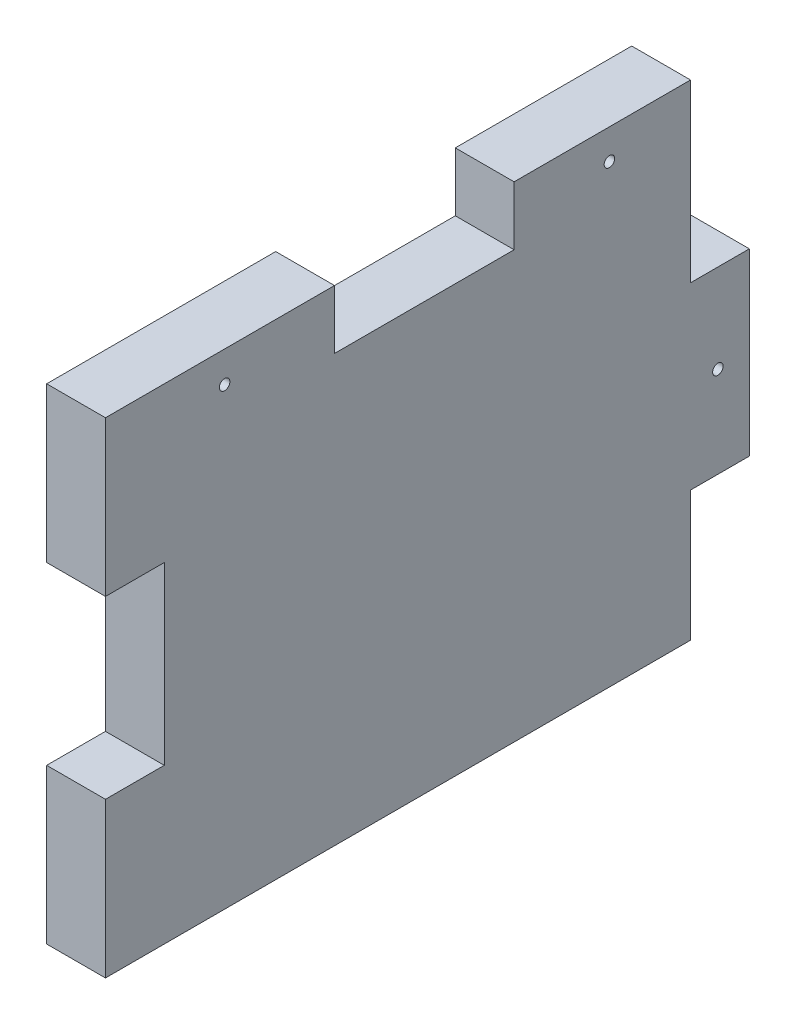
ISO-10303-21;
HEADER;
FILE_DESCRIPTION(('STEP AP214'),'2;1');
FILE_NAME('part.step','',(''),(''),'','','');
FILE_SCHEMA(('AUTOMOTIVE_DESIGN { 1 0 10303 214 1 1 1 1 }'));
ENDSEC;
DATA;
#1=APPLICATION_CONTEXT('core data for automotive mechanical design processes');
#2=APPLICATION_PROTOCOL_DEFINITION('international standard','automotive_design',2000,#1);
#3=PRODUCT_CONTEXT('',#1,'mechanical');
#4=PRODUCT('Part','Part','',(#3));
#5=PRODUCT_RELATED_PRODUCT_CATEGORY('part','',(#4));
#6=PRODUCT_DEFINITION_FORMATION('','',#4);
#7=PRODUCT_DEFINITION_CONTEXT('part definition',#1,'design');
#8=PRODUCT_DEFINITION('design','',#6,#7);
#9=PRODUCT_DEFINITION_SHAPE('','',#8);
#10=(LENGTH_UNIT() NAMED_UNIT(*) SI_UNIT(.MILLI.,.METRE.));
#11=(NAMED_UNIT(*) PLANE_ANGLE_UNIT() SI_UNIT($,.RADIAN.));
#12=(NAMED_UNIT(*) SI_UNIT($,.STERADIAN.) SOLID_ANGLE_UNIT());
#13=UNCERTAINTY_MEASURE_WITH_UNIT(LENGTH_MEASURE(1.E-05),#10,'distance_accuracy_value','');
#14=(GEOMETRIC_REPRESENTATION_CONTEXT(3) GLOBAL_UNCERTAINTY_ASSIGNED_CONTEXT((#13)) GLOBAL_UNIT_ASSIGNED_CONTEXT((#10,
#11,#12)) REPRESENTATION_CONTEXT('',''));
#15=CARTESIAN_POINT('',(0.,0.,0.));
#16=DIRECTION('',(0.,0.,1.));
#17=DIRECTION('',(1.,0.,0.));
#18=AXIS2_PLACEMENT_3D('',#15,#16,#17);
#19=CARTESIAN_POINT('',(0.,0.,189.));
#20=DIRECTION('',(0.,0.,1.));
#21=DIRECTION('',(1.,0.,0.));
#22=AXIS2_PLACEMENT_3D('',#19,#20,#21);
#23=PLANE('',#22);
#24=DIRECTION('',(0.,1.,0.));
#25=VECTOR('',#24,1.);
#26=CARTESIAN_POINT('',(-1878.01840884108,3374.03154429096,189.));
#27=LINE('',#26,#25);
#28=CARTESIAN_POINT('',(-1878.01840884108,3267.29154429096,189.));
#29=VERTEX_POINT('',#28);
#30=CARTESIAN_POINT('',(-1878.01840884108,3324.03154429097,189.));
#31=VERTEX_POINT('',#30);
#32=EDGE_CURVE('E155',#29,#31,#27,.T.);
#33=ORIENTED_EDGE('',*,*,#32,.T.);
#34=CARTESIAN_POINT('',(-1878.01840884108,3324.03154429097,189.));
#35=CARTESIAN_POINT('',(-1897.01840884108,3324.03154429097,189.));
#36=B_SPLINE_CURVE_WITH_KNOTS('',1,(#34,#35),.UNSPECIFIED.,.F.,.F.,(2,2),(0.,0.13768115942029),.UNSPECIFIED.);
#37=CARTESIAN_POINT('',(-1897.01840884108,3324.03154429097,189.));
#38=VERTEX_POINT('',#37);
#39=EDGE_CURVE('E160',#31,#38,#36,.T.);
#40=ORIENTED_EDGE('',*,*,#39,.T.);
#41=DIRECTION('',(0.,-1.,0.));
#42=VECTOR('',#41,1.);
#43=CARTESIAN_POINT('',(-1897.01840884108,3374.03154429096,189.));
#44=LINE('',#43,#42);
#45=CARTESIAN_POINT('',(-1897.01840884108,3267.29154429096,189.));
#46=VERTEX_POINT('',#45);
#47=EDGE_CURVE('E168',#38,#46,#44,.T.);
#48=ORIENTED_EDGE('',*,*,#47,.T.);
#49=CARTESIAN_POINT('',(-1897.01840884108,3267.29154429096,189.));
#50=CARTESIAN_POINT('',(-1878.01840884108,3267.29154429096,189.));
#51=B_SPLINE_CURVE_WITH_KNOTS('',1,(#49,#50),.UNSPECIFIED.,.F.,.F.,(2,2),(0.5,0.63768115942029),.UNSPECIFIED.);
#52=EDGE_CURVE('E166',#46,#29,#51,.T.);
#53=ORIENTED_EDGE('',*,*,#52,.T.);
#54=EDGE_LOOP('',(#33,#40,#48,#53));
#55=FACE_BOUND('',#54,.T.);
#56=ADVANCED_FACE('F33',(#55),#23,.T.);
#57=CARTESIAN_POINT('',(-1897.01840884108,3374.03154429096,189.));
#58=DIRECTION('',(0.,-1.,0.));
#59=DIRECTION('',(0.,0.,-1.));
#60=AXIS2_PLACEMENT_3D('',#57,#58,#59);
#61=PLANE('',#60);
#62=DIRECTION('',(0.,0.,-1.));
#63=VECTOR('',#62,1.);
#64=CARTESIAN_POINT('',(-1897.01840884108,3374.03154429096,189.));
#65=LINE('',#64,#63);
#66=CARTESIAN_POINT('',(-1897.01840884108,3374.03154429096,75.99));
#67=VERTEX_POINT('',#66);
#68=CARTESIAN_POINT('',(-1897.01840884108,3374.03154429096,19.));
#69=VERTEX_POINT('',#68);
#70=EDGE_CURVE('E167',#67,#69,#65,.T.);
#71=ORIENTED_EDGE('',*,*,#70,.F.);
#72=DIRECTION('',(1.,0.,0.));
#73=VECTOR('',#72,1.);
#74=CARTESIAN_POINT('',(-1897.01840884108,3374.03154429096,75.99));
#75=LINE('',#74,#73);
#76=CARTESIAN_POINT('',(-1878.01840884108,3374.03154429096,75.99));
#77=VERTEX_POINT('',#76);
#78=EDGE_CURVE('E11',#67,#77,#75,.T.);
#79=ORIENTED_EDGE('',*,*,#78,.T.);
#80=DIRECTION('',(0.,0.,-1.));
#81=VECTOR('',#80,1.);
#82=CARTESIAN_POINT('',(-1878.01840884108,3374.03154429096,189.));
#83=LINE('',#82,#81);
#84=CARTESIAN_POINT('',(-1878.01840884108,3374.03154429096,19.));
#85=VERTEX_POINT('',#84);
#86=EDGE_CURVE('E189',#77,#85,#83,.T.);
#87=ORIENTED_EDGE('',*,*,#86,.T.);
#88=DIRECTION('',(-1.,0.,0.));
#89=VECTOR('',#88,1.);
#90=CARTESIAN_POINT('',(-1897.01840884108,3374.03154429096,19.));
#91=LINE('',#90,#89);
#92=EDGE_CURVE('E172',#85,#69,#91,.T.);
#93=ORIENTED_EDGE('',*,*,#92,.T.);
#94=EDGE_LOOP('',(#71,#79,#87,#93));
#95=FACE_BOUND('',#94,.T.);
#96=ADVANCED_FACE('F332',(#95),#61,.F.);
#97=CARTESIAN_POINT('',(0.,0.,19.));
#98=DIRECTION('',(0.,0.,1.));
#99=DIRECTION('',(1.,0.,0.));
#100=AXIS2_PLACEMENT_3D('',#97,#98,#99);
#101=PLANE('',#100);
#102=CARTESIAN_POINT('',(-1878.01840884108,3259.29154429096,19.));
#103=CARTESIAN_POINT('',(-1897.01840884108,3259.29154429096,19.));
#104=B_SPLINE_CURVE_WITH_KNOTS('',1,(#102,#103),.UNSPECIFIED.,.F.,.F.,(2,2),(0.,
0.123376623376623),.UNSPECIFIED.);
#105=CARTESIAN_POINT('',(-1878.01840884108,3259.29154429096,19.));
#106=VERTEX_POINT('',#105);
#107=CARTESIAN_POINT('',(-1897.01840884108,3259.29154429096,19.));
#108=VERTEX_POINT('',#107);
#109=EDGE_CURVE('E277',#106,#108,#104,.T.);
#110=ORIENTED_EDGE('',*,*,#109,.F.);
#111=DIRECTION('',(0.,1.,0.));
#112=VECTOR('',#111,1.);
#113=CARTESIAN_POINT('',(-1878.01840884108,3374.03154429096,19.));
#114=LINE('',#113,#112);
#115=CARTESIAN_POINT('',(-1878.01840884108,3217.29154429096,19.));
#116=VERTEX_POINT('',#115);
#117=EDGE_CURVE('E183',#116,#106,#114,.T.);
#118=ORIENTED_EDGE('',*,*,#117,.F.);
#119=DIRECTION('',(1.,0.,0.));
#120=VECTOR('',#119,1.);
#121=CARTESIAN_POINT('',(-1897.01840884108,3217.29154429096,19.));
#122=LINE('',#121,#120);
#123=CARTESIAN_POINT('',(-1897.01840884108,3217.29154429096,19.));
#124=VERTEX_POINT('',#123);
#125=EDGE_CURVE('E179',#124,#116,#122,.T.);
#126=ORIENTED_EDGE('',*,*,#125,.F.);
#127=DIRECTION('',(0.,-1.,0.));
#128=VECTOR('',#127,1.);
#129=CARTESIAN_POINT('',(-1897.01840884108,3374.03154429096,19.));
#130=LINE('',#129,#128);
#131=EDGE_CURVE('E180',#108,#124,#130,.T.);
#132=ORIENTED_EDGE('',*,*,#131,.F.);
#133=EDGE_LOOP('',(#110,#118,#126,#132));
#134=FACE_BOUND('',#133,.T.);
#135=ADVANCED_FACE('F316',(#134),#101,.F.);
#136=CARTESIAN_POINT('',(-1897.01840884108,3317.29154429096,19.));
#137=CARTESIAN_POINT('',(-1878.01840884108,3317.29154429096,19.));
#138=B_SPLINE_CURVE_WITH_KNOTS('',1,(#136,#137),.UNSPECIFIED.,.F.,.F.,(2,2),(0.5,
0.623376623376623),.UNSPECIFIED.);
#139=CARTESIAN_POINT('',(-1897.01840884108,3317.29154429096,19.));
#140=VERTEX_POINT('',#139);
#141=CARTESIAN_POINT('',(-1878.01840884108,3317.29154429096,19.));
#142=VERTEX_POINT('',#141);
#143=EDGE_CURVE('E270',#140,#142,#138,.T.);
#144=ORIENTED_EDGE('',*,*,#143,.F.);
#145=EDGE_CURVE('E176',#69,#140,#130,.T.);
#146=ORIENTED_EDGE('',*,*,#145,.F.);
#147=ORIENTED_EDGE('',*,*,#92,.F.);
#148=EDGE_CURVE('E182',#142,#85,#114,.T.);
#149=ORIENTED_EDGE('',*,*,#148,.F.);
#150=EDGE_LOOP('',(#144,#146,#147,#149));
#151=FACE_BOUND('',#150,.T.);
#152=ADVANCED_FACE('F327',(#151),#101,.F.);
#153=CARTESIAN_POINT('',(-1897.01840884108,3374.03154429096,189.));
#154=DIRECTION('',(1.,0.,0.));
#155=DIRECTION('',(0.,0.,-1.));
#156=AXIS2_PLACEMENT_3D('',#153,#154,#155);
#157=PLANE('',#156);
#158=CARTESIAN_POINT('',(-1897.01840884108,3288.70209537855,10.167430180868));
#159=DIRECTION('',(-1.,0.,0.));
#160=DIRECTION('',(0.,0.,1.));
#161=AXIS2_PLACEMENT_3D('',#158,#159,#160);
#162=CIRCLE('',#161,1.70000000000003);
#163=CARTESIAN_POINT('',(-1897.01840884108,3288.70209537855,11.867430180868));
#164=VERTEX_POINT('',#163);
#165=EDGE_CURVE('E363',#164,#164,#162,.T.);
#166=ORIENTED_EDGE('',*,*,#165,.F.);
#167=EDGE_LOOP('',(#166));
#168=FACE_BOUND('',#167,.T.);
#169=CARTESIAN_POINT('',(-1897.01840884108,3364.29610942721,45.2046557399301));
#170=DIRECTION('',(-1.,0.,0.));
#171=DIRECTION('',(0.,0.,1.));
#172=AXIS2_PLACEMENT_3D('',#169,#170,#171);
#173=CIRCLE('',#172,1.70000000000003);
#174=CARTESIAN_POINT('',(-1897.01840884108,3364.29610942721,46.9046557399301));
#175=VERTEX_POINT('',#174);
#176=EDGE_CURVE('E357',#175,#175,#173,.T.);
#177=ORIENTED_EDGE('',*,*,#176,.F.);
#178=EDGE_LOOP('',(#177));
#179=FACE_BOUND('',#178,.T.);
#180=CARTESIAN_POINT('',(-1897.01840884108,3364.05612843023,169.514812175507));
#181=DIRECTION('',(-1.,0.,0.));
#182=DIRECTION('',(0.,0.,1.));
#183=AXIS2_PLACEMENT_3D('',#180,#181,#182);
#184=CIRCLE('',#183,1.70000000000003);
#185=CARTESIAN_POINT('',(-1897.01840884108,3364.05612843023,171.214812175507));
#186=VERTEX_POINT('',#185);
#187=EDGE_CURVE('E351',#186,#186,#184,.T.);
#188=ORIENTED_EDGE('',*,*,#187,.F.);
#189=EDGE_LOOP('',(#188));
#190=FACE_BOUND('',#189,.T.);
#191=DIRECTION('',(0.,0.,1.));
#192=VECTOR('',#191,1.);
#193=CARTESIAN_POINT('',(-1897.01840884108,3355.02154429096,134.01));
#194=LINE('',#193,#192);
#195=CARTESIAN_POINT('',(-1897.01840884108,3355.02154429096,75.99));
#196=VERTEX_POINT('',#195);
#197=CARTESIAN_POINT('',(-1897.01840884108,3355.02154429096,134.01));
#198=VERTEX_POINT('',#197);
#199=EDGE_CURVE('E239',#196,#198,#194,.T.);
#200=ORIENTED_EDGE('',*,*,#199,.F.);
#201=DIRECTION('',(0.,-1.,0.));
#202=VECTOR('',#201,1.);
#203=CARTESIAN_POINT('',(-1897.01840884108,3355.02154429096,75.99));
#204=LINE('',#203,#202);
#205=EDGE_CURVE('E242',#67,#196,#204,.T.);
#206=ORIENTED_EDGE('',*,*,#205,.F.);
#207=ORIENTED_EDGE('',*,*,#70,.T.);
#208=ORIENTED_EDGE('',*,*,#145,.T.);
#209=DIRECTION('',(0.,0.,1.));
#210=VECTOR('',#209,1.);
#211=CARTESIAN_POINT('',(-1897.01840884108,3317.29154429096,-19.));
#212=LINE('',#211,#210);
#213=CARTESIAN_POINT('',(-1897.01840884108,3317.29154429096,0.));
#214=VERTEX_POINT('',#213);
#215=EDGE_CURVE('E276',#214,#140,#212,.T.);
#216=ORIENTED_EDGE('',*,*,#215,.F.);
#217=DIRECTION('',(0.,1.,0.));
#218=VECTOR('',#217,1.);
#219=CARTESIAN_POINT('',(-1897.01840884108,3259.29154429096,0.));
#220=LINE('',#219,#218);
#221=CARTESIAN_POINT('',(-1897.01840884108,3259.29154429096,0.));
#222=VERTEX_POINT('',#221);
#223=EDGE_CURVE('E292',#222,#214,#220,.T.);
#224=ORIENTED_EDGE('',*,*,#223,.F.);
#225=DIRECTION('',(0.,0.,1.));
#226=VECTOR('',#225,1.);
#227=CARTESIAN_POINT('',(-1897.01840884108,3259.29154429096,-19.));
#228=LINE('',#227,#226);
#229=EDGE_CURVE('E285',#222,#108,#228,.T.);
#230=ORIENTED_EDGE('',*,*,#229,.T.);
#231=ORIENTED_EDGE('',*,*,#131,.T.);
#232=DIRECTION('',(0.,0.,-1.));
#233=VECTOR('',#232,1.);
#234=CARTESIAN_POINT('',(-1897.01840884108,3217.29154429096,189.));
#235=LINE('',#234,#233);
#236=CARTESIAN_POINT('',(-1897.01840884108,3217.29154429096,208.));
#237=VERTEX_POINT('',#236);
#238=EDGE_CURVE('E196',#237,#124,#235,.T.);
#239=ORIENTED_EDGE('',*,*,#238,.F.);
#240=DIRECTION('',(0.,-1.,0.));
#241=VECTOR('',#240,1.);
#242=CARTESIAN_POINT('',(-1897.01840884108,3217.29154429096,208.));
#243=LINE('',#242,#241);
#244=CARTESIAN_POINT('',(-1897.01840884108,3267.29154429096,208.));
#245=VERTEX_POINT('',#244);
#246=EDGE_CURVE('E225',#245,#237,#243,.T.);
#247=ORIENTED_EDGE('',*,*,#246,.F.);
#248=DIRECTION('',(0.,0.,-1.));
#249=VECTOR('',#248,1.);
#250=CARTESIAN_POINT('',(-1897.01840884108,3267.29154429096,227.));
#251=LINE('',#250,#249);
#252=EDGE_CURVE('E214',#245,#46,#251,.T.);
#253=ORIENTED_EDGE('',*,*,#252,.T.);
#254=ORIENTED_EDGE('',*,*,#47,.F.);
#255=DIRECTION('',(0.,0.,-1.));
#256=VECTOR('',#255,1.);
#257=CARTESIAN_POINT('',(-1897.01840884108,3324.03154429097,227.));
#258=LINE('',#257,#256);
#259=CARTESIAN_POINT('',(-1897.01840884108,3324.03154429097,208.));
#260=VERTEX_POINT('',#259);
#261=EDGE_CURVE('E48',#260,#38,#258,.T.);
#262=ORIENTED_EDGE('',*,*,#261,.F.);
#263=DIRECTION('',(0.,-1.,0.));
#264=VECTOR('',#263,1.);
#265=CARTESIAN_POINT('',(-1897.01840884108,3324.03154429097,208.));
#266=LINE('',#265,#264);
#267=CARTESIAN_POINT('',(-1897.01840884108,3374.03154429096,208.));
#268=VERTEX_POINT('',#267);
#269=EDGE_CURVE('E210',#268,#260,#266,.T.);
#270=ORIENTED_EDGE('',*,*,#269,.F.);
#271=CARTESIAN_POINT('',(-1897.01840884108,3374.03154429096,134.01));
#272=VERTEX_POINT('',#271);
#273=EDGE_CURVE('E170',#268,#272,#65,.T.);
#274=ORIENTED_EDGE('',*,*,#273,.T.);
#275=DIRECTION('',(0.,1.,0.));
#276=VECTOR('',#275,1.);
#277=CARTESIAN_POINT('',(-1897.01840884108,3374.04154429096,134.01));
#278=LINE('',#277,#276);
#279=EDGE_CURVE('E209',#198,#272,#278,.T.);
#280=ORIENTED_EDGE('',*,*,#279,.F.);
#281=EDGE_LOOP('',(#200,#206,#207,#208,#216,#224,#230,#231,#239,#247,#253,#254,#262,#270,#274,#280));
#282=FACE_BOUND('',#281,.T.);
#283=ADVANCED_FACE('F35',(#168,#179,#190,#282),#157,.F.);
#284=CARTESIAN_POINT('',(-1897.01840884108,3217.29154429096,189.));
#285=DIRECTION('',(0.,1.,0.));
#286=DIRECTION('',(0.,0.,1.));
#287=AXIS2_PLACEMENT_3D('',#284,#285,#286);
#288=PLANE('',#287);
#289=ORIENTED_EDGE('',*,*,#125,.T.);
#290=DIRECTION('',(0.,0.,-1.));
#291=VECTOR('',#290,1.);
#292=CARTESIAN_POINT('',(-1878.01840884108,3217.29154429096,189.));
#293=LINE('',#292,#291);
#294=CARTESIAN_POINT('',(-1878.01840884108,3217.29154429096,208.));
#295=VERTEX_POINT('',#294);
#296=EDGE_CURVE('E193',#295,#116,#293,.T.);
#297=ORIENTED_EDGE('',*,*,#296,.F.);
#298=DIRECTION('',(1.,0.,0.));
#299=VECTOR('',#298,1.);
#300=CARTESIAN_POINT('',(-1878.01840884108,3217.29154429096,208.));
#301=LINE('',#300,#299);
#302=EDGE_CURVE('E223',#237,#295,#301,.T.);
#303=ORIENTED_EDGE('',*,*,#302,.F.);
#304=ORIENTED_EDGE('',*,*,#238,.T.);
#305=EDGE_LOOP('',(#289,#297,#303,#304));
#306=FACE_BOUND('',#305,.T.);
#307=ADVANCED_FACE('F371',(#306),#288,.F.);
#308=CARTESIAN_POINT('',(-1878.01840884108,3374.03154429096,189.));
#309=DIRECTION('',(-1.,0.,0.));
#310=DIRECTION('',(0.,0.,1.));
#311=AXIS2_PLACEMENT_3D('',#308,#309,#310);
#312=PLANE('',#311);
#313=CARTESIAN_POINT('',(-1878.01840884108,3288.70209537855,10.167430180868));
#314=DIRECTION('',(-1.,0.,0.));
#315=DIRECTION('',(0.,0.,1.));
#316=AXIS2_PLACEMENT_3D('',#313,#314,#315);
#317=CIRCLE('',#316,1.70000000000003);
#318=CARTESIAN_POINT('',(-1878.01840884108,3288.70209537855,11.867430180868));
#319=VERTEX_POINT('',#318);
#320=EDGE_CURVE('E360',#319,#319,#317,.T.);
#321=ORIENTED_EDGE('',*,*,#320,.T.);
#322=EDGE_LOOP('',(#321));
#323=FACE_BOUND('',#322,.T.);
#324=CARTESIAN_POINT('',(-1878.01840884108,3364.29610942721,45.2046557399301));
#325=DIRECTION('',(-1.,0.,0.));
#326=DIRECTION('',(0.,0.,1.));
#327=AXIS2_PLACEMENT_3D('',#324,#325,#326);
#328=CIRCLE('',#327,1.70000000000003);
#329=CARTESIAN_POINT('',(-1878.01840884108,3364.29610942721,46.9046557399301));
#330=VERTEX_POINT('',#329);
#331=EDGE_CURVE('E354',#330,#330,#328,.T.);
#332=ORIENTED_EDGE('',*,*,#331,.T.);
#333=EDGE_LOOP('',(#332));
#334=FACE_BOUND('',#333,.T.);
#335=CARTESIAN_POINT('',(-1878.01840884108,3364.05612843023,169.514812175507));
#336=DIRECTION('',(-1.,0.,0.));
#337=DIRECTION('',(0.,0.,1.));
#338=AXIS2_PLACEMENT_3D('',#335,#336,#337);
#339=CIRCLE('',#338,1.70000000000003);
#340=CARTESIAN_POINT('',(-1878.01840884108,3364.05612843023,171.214812175507));
#341=VERTEX_POINT('',#340);
#342=EDGE_CURVE('E164',#341,#341,#339,.T.);
#343=ORIENTED_EDGE('',*,*,#342,.T.);
#344=EDGE_LOOP('',(#343));
#345=FACE_BOUND('',#344,.T.);
#346=ORIENTED_EDGE('',*,*,#86,.F.);
#347=CARTESIAN_POINT('',(-1878.01840884108,3355.02154429096,75.99));
#348=CARTESIAN_POINT('',(-1878.01840884108,3374.04154429096,75.99));
#349=B_SPLINE_CURVE_WITH_KNOTS('',1,(#347,#348),.UNSPECIFIED.,.F.,.F.,(2,2),(0.,
0.123442367601245),.UNSPECIFIED.);
#350=CARTESIAN_POINT('',(-1878.01840884108,3355.02154429096,75.99));
#351=VERTEX_POINT('',#350);
#352=EDGE_CURVE('E237',#351,#77,#349,.T.);
#353=ORIENTED_EDGE('',*,*,#352,.F.);
#354=CARTESIAN_POINT('',(-1878.01840884108,3355.02154429096,134.01));
#355=CARTESIAN_POINT('',(-1878.01840884108,3355.02154429096,75.99));
#356=B_SPLINE_CURVE_WITH_KNOTS('',1,(#354,#355),.UNSPECIFIED.,.F.,.F.,(2,2),(0.623442367601245,
1.),.UNSPECIFIED.);
#357=CARTESIAN_POINT('',(-1878.01840884108,3355.02154429096,134.01));
#358=VERTEX_POINT('',#357);
#359=EDGE_CURVE('E255',#358,#351,#356,.T.);
#360=ORIENTED_EDGE('',*,*,#359,.F.);
#361=CARTESIAN_POINT('',(-1878.01840884108,3374.04154429096,134.01));
#362=CARTESIAN_POINT('',(-1878.01840884108,3355.02154429096,134.01));
#363=B_SPLINE_CURVE_WITH_KNOTS('',1,(#361,#362),.UNSPECIFIED.,.F.,.F.,(2,2),(0.5,
0.623442367601245),.UNSPECIFIED.);
#364=CARTESIAN_POINT('',(-1878.01840884108,3374.03154429096,134.01));
#365=VERTEX_POINT('',#364);
#366=EDGE_CURVE('E248',#365,#358,#363,.T.);
#367=ORIENTED_EDGE('',*,*,#366,.F.);
#368=CARTESIAN_POINT('',(-1878.01840884108,3374.03154429096,208.));
#369=VERTEX_POINT('',#368);
#370=EDGE_CURVE('E190',#369,#365,#83,.T.);
#371=ORIENTED_EDGE('',*,*,#370,.F.);
#372=DIRECTION('',(0.,1.,0.));
#373=VECTOR('',#372,1.);
#374=CARTESIAN_POINT('',(-1878.01840884108,3374.03154429096,208.));
#375=LINE('',#374,#373);
#376=CARTESIAN_POINT('',(-1878.01840884108,3324.03154429097,208.));
#377=VERTEX_POINT('',#376);
#378=EDGE_CURVE('E157',#377,#369,#375,.T.);
#379=ORIENTED_EDGE('',*,*,#378,.F.);
#380=DIRECTION('',(0.,0.,-1.));
#381=VECTOR('',#380,1.);
#382=CARTESIAN_POINT('',(-1878.01840884108,3324.03154429097,227.));
#383=LINE('',#382,#381);
#384=EDGE_CURVE('E151',#377,#31,#383,.T.);
#385=ORIENTED_EDGE('',*,*,#384,.T.);
#386=ORIENTED_EDGE('',*,*,#32,.F.);
#387=DIRECTION('',(0.,0.,-1.));
#388=VECTOR('',#387,1.);
#389=CARTESIAN_POINT('',(-1878.01840884108,3267.29154429096,227.));
#390=LINE('',#389,#388);
#391=CARTESIAN_POINT('',(-1878.01840884108,3267.29154429096,208.));
#392=VERTEX_POINT('',#391);
#393=EDGE_CURVE('E56',#392,#29,#390,.T.);
#394=ORIENTED_EDGE('',*,*,#393,.F.);
#395=DIRECTION('',(0.,1.,0.));
#396=VECTOR('',#395,1.);
#397=CARTESIAN_POINT('',(-1878.01840884108,3267.29154429096,208.));
#398=LINE('',#397,#396);
#399=EDGE_CURVE('E221',#295,#392,#398,.T.);
#400=ORIENTED_EDGE('',*,*,#399,.F.);
#401=ORIENTED_EDGE('',*,*,#296,.T.);
#402=ORIENTED_EDGE('',*,*,#117,.T.);
#403=DIRECTION('',(0.,0.,1.));
#404=VECTOR('',#403,1.);
#405=CARTESIAN_POINT('',(-1878.01840884108,3259.29154429096,-19.));
#406=LINE('',#405,#404);
#407=CARTESIAN_POINT('',(-1878.01840884108,3259.29154429096,0.));
#408=VERTEX_POINT('',#407);
#409=EDGE_CURVE('E244',#408,#106,#406,.T.);
#410=ORIENTED_EDGE('',*,*,#409,.F.);
#411=DIRECTION('',(0.,-1.,0.));
#412=VECTOR('',#411,1.);
#413=CARTESIAN_POINT('',(-1878.01840884108,3317.29154429096,0.));
#414=LINE('',#413,#412);
#415=CARTESIAN_POINT('',(-1878.01840884108,3317.29154429096,0.));
#416=VERTEX_POINT('',#415);
#417=EDGE_CURVE('E298',#416,#408,#414,.T.);
#418=ORIENTED_EDGE('',*,*,#417,.F.);
#419=DIRECTION('',(0.,0.,1.));
#420=VECTOR('',#419,1.);
#421=CARTESIAN_POINT('',(-1878.01840884108,3317.29154429096,-19.));
#422=LINE('',#421,#420);
#423=EDGE_CURVE('E275',#416,#142,#422,.T.);
#424=ORIENTED_EDGE('',*,*,#423,.T.);
#425=ORIENTED_EDGE('',*,*,#148,.T.);
#426=EDGE_LOOP('',(#346,#353,#360,#367,#371,#379,#385,#386,#394,#400,#401,#402,#410,#418,#424,#425));
#427=FACE_BOUND('',#426,.T.);
#428=ADVANCED_FACE('F153',(#323,#334,#345,#427),#312,.F.);
#429=ORIENTED_EDGE('',*,*,#370,.T.);
#430=DIRECTION('',(-1.,0.,0.));
#431=VECTOR('',#430,1.);
#432=CARTESIAN_POINT('',(-1897.01840884108,3374.03154429096,134.01));
#433=LINE('',#432,#431);
#434=EDGE_CURVE('E41',#365,#272,#433,.T.);
#435=ORIENTED_EDGE('',*,*,#434,.T.);
#436=ORIENTED_EDGE('',*,*,#273,.F.);
#437=DIRECTION('',(-1.,0.,0.));
#438=VECTOR('',#437,1.);
#439=CARTESIAN_POINT('',(-1897.01840884108,3374.03154429096,208.));
#440=LINE('',#439,#438);
#441=EDGE_CURVE('E158',#369,#268,#440,.T.);
#442=ORIENTED_EDGE('',*,*,#441,.F.);
#443=EDGE_LOOP('',(#429,#435,#436,#442));
#444=FACE_BOUND('',#443,.T.);
#445=ADVANCED_FACE('F200',(#444),#61,.F.);
#446=CARTESIAN_POINT('',(-1878.01840884108,3259.29154429096,-19.));
#447=DIRECTION('',(0.,1.,0.));
#448=DIRECTION('',(0.,0.,1.));
#449=AXIS2_PLACEMENT_3D('',#446,#447,#448);
#450=PLANE('',#449);
#451=DIRECTION('',(-1.,0.,0.));
#452=VECTOR('',#451,1.);
#453=CARTESIAN_POINT('',(-1878.01840884108,3259.29154429096,0.));
#454=LINE('',#453,#452);
#455=EDGE_CURVE('E295',#408,#222,#454,.T.);
#456=ORIENTED_EDGE('',*,*,#455,.F.);
#457=ORIENTED_EDGE('',*,*,#409,.T.);
#458=ORIENTED_EDGE('',*,*,#109,.T.);
#459=ORIENTED_EDGE('',*,*,#229,.F.);
#460=EDGE_LOOP('',(#456,#457,#458,#459));
#461=FACE_BOUND('',#460,.T.);
#462=ADVANCED_FACE('F309',(#461),#450,.F.);
#463=CARTESIAN_POINT('',(-1897.01840884108,3317.29154429096,-19.));
#464=DIRECTION('',(0.,-1.,0.));
#465=DIRECTION('',(0.,0.,-1.));
#466=AXIS2_PLACEMENT_3D('',#463,#464,#465);
#467=PLANE('',#466);
#468=DIRECTION('',(1.,0.,0.));
#469=VECTOR('',#468,1.);
#470=CARTESIAN_POINT('',(-1897.01840884108,3317.29154429096,0.));
#471=LINE('',#470,#469);
#472=EDGE_CURVE('E286',#214,#416,#471,.T.);
#473=ORIENTED_EDGE('',*,*,#472,.F.);
#474=ORIENTED_EDGE('',*,*,#215,.T.);
#475=ORIENTED_EDGE('',*,*,#143,.T.);
#476=ORIENTED_EDGE('',*,*,#423,.F.);
#477=EDGE_LOOP('',(#473,#474,#475,#476));
#478=FACE_BOUND('',#477,.T.);
#479=ADVANCED_FACE('F321',(#478),#467,.F.);
#480=CARTESIAN_POINT('',(0.,0.,0.));
#481=DIRECTION('',(0.,0.,-1.));
#482=DIRECTION('',(-1.,0.,0.));
#483=AXIS2_PLACEMENT_3D('',#480,#481,#482);
#484=PLANE('',#483);
#485=ORIENTED_EDGE('',*,*,#417,.T.);
#486=ORIENTED_EDGE('',*,*,#455,.T.);
#487=ORIENTED_EDGE('',*,*,#223,.T.);
#488=ORIENTED_EDGE('',*,*,#472,.T.);
#489=EDGE_LOOP('',(#485,#486,#487,#488));
#490=FACE_BOUND('',#489,.T.);
#491=ADVANCED_FACE('F319',(#490),#484,.T.);
#492=CARTESIAN_POINT('',(-1916.01840884108,3355.02154429096,75.99));
#493=DIRECTION('',(0.,0.,-1.));
#494=DIRECTION('',(-1.,0.,0.));
#495=AXIS2_PLACEMENT_3D('',#492,#493,#494);
#496=PLANE('',#495);
#497=ORIENTED_EDGE('',*,*,#205,.T.);
#498=DIRECTION('',(1.,0.,0.));
#499=VECTOR('',#498,1.);
#500=CARTESIAN_POINT('',(-1916.01840884108,3355.02154429096,75.99));
#501=LINE('',#500,#499);
#502=EDGE_CURVE('E240',#196,#351,#501,.T.);
#503=ORIENTED_EDGE('',*,*,#502,.T.);
#504=ORIENTED_EDGE('',*,*,#352,.T.);
#505=ORIENTED_EDGE('',*,*,#78,.F.);
#506=EDGE_LOOP('',(#497,#503,#504,#505));
#507=FACE_BOUND('',#506,.T.);
#508=ADVANCED_FACE('F334',(#507),#496,.F.);
#509=CARTESIAN_POINT('',(-1916.01840884108,3374.04154429096,134.01));
#510=DIRECTION('',(0.,0.,1.));
#511=DIRECTION('',(1.,0.,0.));
#512=AXIS2_PLACEMENT_3D('',#509,#510,#511);
#513=PLANE('',#512);
#514=ORIENTED_EDGE('',*,*,#366,.T.);
#515=DIRECTION('',(1.,0.,0.));
#516=VECTOR('',#515,1.);
#517=CARTESIAN_POINT('',(-1916.01840884108,3355.02154429096,134.01));
#518=LINE('',#517,#516);
#519=EDGE_CURVE('E263',#198,#358,#518,.T.);
#520=ORIENTED_EDGE('',*,*,#519,.F.);
#521=ORIENTED_EDGE('',*,*,#279,.T.);
#522=ORIENTED_EDGE('',*,*,#434,.F.);
#523=EDGE_LOOP('',(#514,#520,#521,#522));
#524=FACE_BOUND('',#523,.T.);
#525=ADVANCED_FACE('F339',(#524),#513,.F.);
#526=CARTESIAN_POINT('',(-1916.01840884108,3355.02154429096,134.01));
#527=DIRECTION('',(0.,-1.,0.));
#528=DIRECTION('',(0.,0.,-1.));
#529=AXIS2_PLACEMENT_3D('',#526,#527,#528);
#530=PLANE('',#529);
#531=ORIENTED_EDGE('',*,*,#199,.T.);
#532=ORIENTED_EDGE('',*,*,#519,.T.);
#533=ORIENTED_EDGE('',*,*,#359,.T.);
#534=ORIENTED_EDGE('',*,*,#502,.F.);
#535=EDGE_LOOP('',(#531,#532,#533,#534));
#536=FACE_BOUND('',#535,.T.);
#537=ADVANCED_FACE('F338',(#536),#530,.F.);
#538=CARTESIAN_POINT('',(-1897.01840884108,3267.29154429096,227.));
#539=DIRECTION('',(0.,1.,0.));
#540=DIRECTION('',(0.,0.,1.));
#541=AXIS2_PLACEMENT_3D('',#538,#539,#540);
#542=PLANE('',#541);
#543=DIRECTION('',(-1.,0.,0.));
#544=VECTOR('',#543,1.);
#545=CARTESIAN_POINT('',(-1897.01840884108,3267.29154429096,208.));
#546=LINE('',#545,#544);
#547=EDGE_CURVE('E219',#392,#245,#546,.T.);
#548=ORIENTED_EDGE('',*,*,#547,.F.);
#549=ORIENTED_EDGE('',*,*,#393,.T.);
#550=ORIENTED_EDGE('',*,*,#52,.F.);
#551=ORIENTED_EDGE('',*,*,#252,.F.);
#552=EDGE_LOOP('',(#548,#549,#550,#551));
#553=FACE_BOUND('',#552,.T.);
#554=ADVANCED_FACE('F412',(#553),#542,.T.);
#555=CARTESIAN_POINT('',(0.,0.,208.));
#556=DIRECTION('',(0.,0.,-1.));
#557=DIRECTION('',(-1.,0.,0.));
#558=AXIS2_PLACEMENT_3D('',#555,#556,#557);
#559=PLANE('',#558);
#560=ORIENTED_EDGE('',*,*,#302,.T.);
#561=ORIENTED_EDGE('',*,*,#399,.T.);
#562=ORIENTED_EDGE('',*,*,#547,.T.);
#563=ORIENTED_EDGE('',*,*,#246,.T.);
#564=EDGE_LOOP('',(#560,#561,#562,#563));
#565=FACE_BOUND('',#564,.T.);
#566=ADVANCED_FACE('F410',(#565),#559,.F.);
#567=CARTESIAN_POINT('',(-1878.01840884108,3324.03154429097,227.));
#568=DIRECTION('',(0.,-1.,0.));
#569=DIRECTION('',(0.,0.,-1.));
#570=AXIS2_PLACEMENT_3D('',#567,#568,#569);
#571=PLANE('',#570);
#572=DIRECTION('',(1.,0.,0.));
#573=VECTOR('',#572,1.);
#574=CARTESIAN_POINT('',(-1878.01840884108,3324.03154429097,208.));
#575=LINE('',#574,#573);
#576=EDGE_CURVE('E212',#260,#377,#575,.T.);
#577=ORIENTED_EDGE('',*,*,#576,.F.);
#578=ORIENTED_EDGE('',*,*,#261,.T.);
#579=ORIENTED_EDGE('',*,*,#39,.F.);
#580=ORIENTED_EDGE('',*,*,#384,.F.);
#581=EDGE_LOOP('',(#577,#578,#579,#580));
#582=FACE_BOUND('',#581,.T.);
#583=ADVANCED_FACE('F161',(#582),#571,.T.);
#584=CARTESIAN_POINT('',(0.,0.,208.));
#585=DIRECTION('',(0.,0.,-1.));
#586=DIRECTION('',(-1.,0.,0.));
#587=AXIS2_PLACEMENT_3D('',#584,#585,#586);
#588=PLANE('',#587);
#589=ORIENTED_EDGE('',*,*,#576,.T.);
#590=ORIENTED_EDGE('',*,*,#378,.T.);
#591=ORIENTED_EDGE('',*,*,#441,.T.);
#592=ORIENTED_EDGE('',*,*,#269,.T.);
#593=EDGE_LOOP('',(#589,#590,#591,#592));
#594=FACE_BOUND('',#593,.T.);
#595=ADVANCED_FACE('F340',(#594),#588,.F.);
#596=CARTESIAN_POINT('',(-1897.01840884108,3364.05612843023,169.514812175507));
#597=DIRECTION('',(-1.,0.,0.));
#598=DIRECTION('',(0.,0.,1.));
#599=AXIS2_PLACEMENT_3D('',#596,#597,#598);
#600=CYLINDRICAL_SURFACE('',#599,1.70000000000003);
#601=ORIENTED_EDGE('',*,*,#342,.F.);
#602=EDGE_LOOP('',(#601));
#603=FACE_BOUND('',#602,.T.);
#604=ORIENTED_EDGE('',*,*,#187,.T.);
#605=EDGE_LOOP('',(#604));
#606=FACE_BOUND('',#605,.T.);
#607=ADVANCED_FACE('F376',(#603,#606),#600,.F.);
#608=CARTESIAN_POINT('',(-1897.01840884108,3364.29610942721,45.2046557399301));
#609=DIRECTION('',(-1.,0.,0.));
#610=DIRECTION('',(0.,0.,1.));
#611=AXIS2_PLACEMENT_3D('',#608,#609,#610);
#612=CYLINDRICAL_SURFACE('',#611,1.70000000000003);
#613=ORIENTED_EDGE('',*,*,#331,.F.);
#614=EDGE_LOOP('',(#613));
#615=FACE_BOUND('',#614,.T.);
#616=ORIENTED_EDGE('',*,*,#176,.T.);
#617=EDGE_LOOP('',(#616));
#618=FACE_BOUND('',#617,.T.);
#619=ADVANCED_FACE('F378',(#615,#618),#612,.F.);
#620=CARTESIAN_POINT('',(-1897.01840884108,3288.70209537855,10.167430180868));
#621=DIRECTION('',(-1.,0.,0.));
#622=DIRECTION('',(0.,0.,1.));
#623=AXIS2_PLACEMENT_3D('',#620,#621,#622);
#624=CYLINDRICAL_SURFACE('',#623,1.70000000000003);
#625=ORIENTED_EDGE('',*,*,#320,.F.);
#626=EDGE_LOOP('',(#625));
#627=FACE_BOUND('',#626,.T.);
#628=ORIENTED_EDGE('',*,*,#165,.T.);
#629=EDGE_LOOP('',(#628));
#630=FACE_BOUND('',#629,.T.);
#631=ADVANCED_FACE('F367',(#627,#630),#624,.F.);
#632=CLOSED_SHELL('',(#56,#96,#135,#152,#283,#307,#428,#445,#462,#479,#491,#508,#525,#537,#554,
#566,#583,#595,#607,#619,#631));
#633=MANIFOLD_SOLID_BREP('B2',#632);
#634=ADVANCED_BREP_SHAPE_REPRESENTATION('',(#18,#633),#14);
#635=SHAPE_DEFINITION_REPRESENTATION(#9,#634);
ENDSEC;
END-ISO-10303-21;
